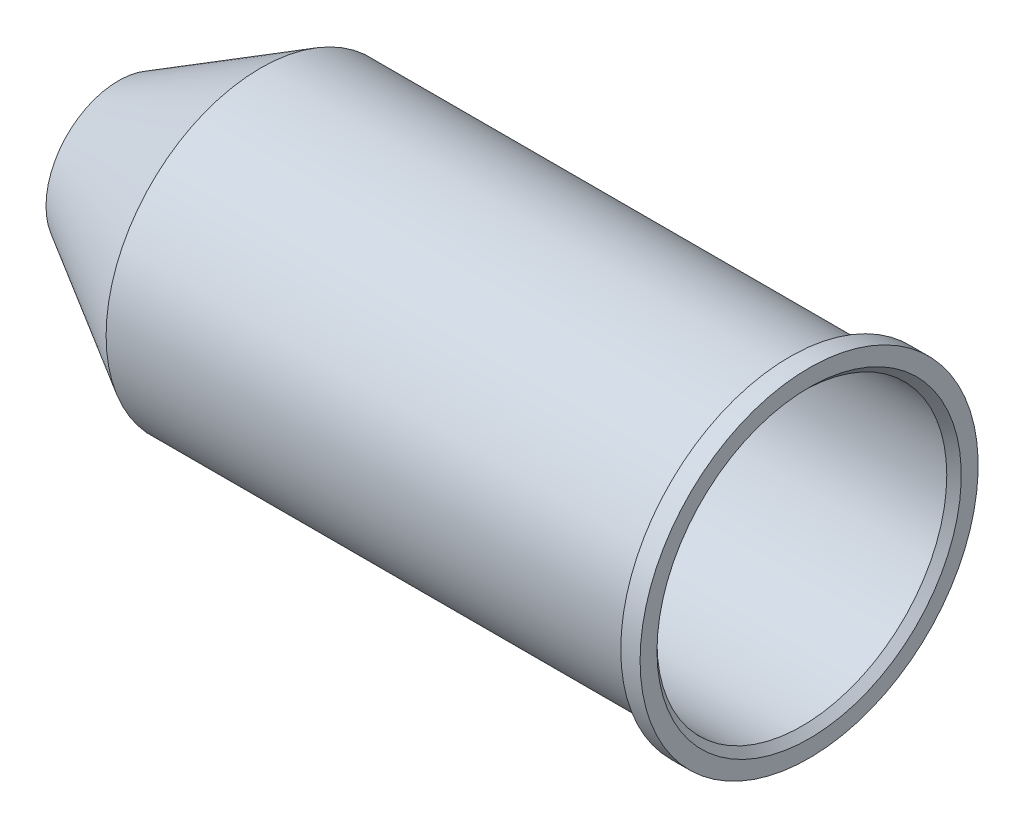
ISO-10303-21;
HEADER;
FILE_DESCRIPTION(('STEP AP214'),'2;1');
FILE_NAME('part.step','',(''),(''),'','','');
FILE_SCHEMA(('AUTOMOTIVE_DESIGN { 1 0 10303 214 1 1 1 1 }'));
ENDSEC;
DATA;
#1=APPLICATION_CONTEXT('core data for automotive mechanical design processes');
#2=APPLICATION_PROTOCOL_DEFINITION('international standard','automotive_design',2000,#1);
#3=PRODUCT_CONTEXT('',#1,'mechanical');
#4=PRODUCT('Part','Part','',(#3));
#5=PRODUCT_RELATED_PRODUCT_CATEGORY('part','',(#4));
#6=PRODUCT_DEFINITION_FORMATION('','',#4);
#7=PRODUCT_DEFINITION_CONTEXT('part definition',#1,'design');
#8=PRODUCT_DEFINITION('design','',#6,#7);
#9=PRODUCT_DEFINITION_SHAPE('','',#8);
#10=(LENGTH_UNIT() NAMED_UNIT(*) SI_UNIT(.MILLI.,.METRE.));
#11=(NAMED_UNIT(*) PLANE_ANGLE_UNIT() SI_UNIT($,.RADIAN.));
#12=(NAMED_UNIT(*) SI_UNIT($,.STERADIAN.) SOLID_ANGLE_UNIT());
#13=UNCERTAINTY_MEASURE_WITH_UNIT(LENGTH_MEASURE(1.E-05),#10,'distance_accuracy_value','');
#14=(GEOMETRIC_REPRESENTATION_CONTEXT(3) GLOBAL_UNCERTAINTY_ASSIGNED_CONTEXT((#13)) GLOBAL_UNIT_ASSIGNED_CONTEXT((#10,
#11,#12)) REPRESENTATION_CONTEXT('',''));
#15=CARTESIAN_POINT('',(0.,0.,0.));
#16=DIRECTION('',(0.,0.,1.));
#17=DIRECTION('',(1.,0.,0.));
#18=AXIS2_PLACEMENT_3D('',#15,#16,#17);
#19=CARTESIAN_POINT('',(0.,15.,0.));
#20=DIRECTION('',(1.,0.,0.));
#21=DIRECTION('',(0.,0.,-1.));
#22=AXIS2_PLACEMENT_3D('',#19,#20,#21);
#23=PLANE('',#22);
#24=CARTESIAN_POINT('',(0.,0.,0.));
#25=DIRECTION('',(-1.,0.,0.));
#26=DIRECTION('',(0.,0.,1.));
#27=AXIS2_PLACEMENT_3D('',#24,#25,#26);
#28=CIRCLE('',#27,12.);
#29=CARTESIAN_POINT('',(0.,0.,12.));
#30=VERTEX_POINT('',#29);
#31=EDGE_CURVE('E10',#30,#30,#28,.T.);
#32=ORIENTED_EDGE('',*,*,#31,.F.);
#33=EDGE_LOOP('',(#32));
#34=FACE_BOUND('',#33,.T.);
#35=CARTESIAN_POINT('',(0.,0.,0.));
#36=DIRECTION('',(-1.,0.,0.));
#37=DIRECTION('',(0.,0.,1.));
#38=AXIS2_PLACEMENT_3D('',#35,#36,#37);
#39=CIRCLE('',#38,15.);
#40=CARTESIAN_POINT('',(0.,0.,15.));
#41=VERTEX_POINT('',#40);
#42=EDGE_CURVE('E95',#41,#41,#39,.T.);
#43=ORIENTED_EDGE('',*,*,#42,.T.);
#44=EDGE_LOOP('',(#43));
#45=FACE_BOUND('',#44,.T.);
#46=ADVANCED_FACE('F40',(#34,#45),#23,.F.);
#47=CARTESIAN_POINT('',(0.,0.,0.));
#48=DIRECTION('',(-1.,0.,0.));
#49=DIRECTION('',(0.,0.,1.));
#50=AXIS2_PLACEMENT_3D('',#47,#48,#49);
#51=CONICAL_SURFACE('',#50,12.,0.26179938779915);
#52=CARTESIAN_POINT('',(16.7942286340599,0.,0.));
#53=DIRECTION('',(-1.,0.,0.));
#54=DIRECTION('',(0.,0.,1.));
#55=AXIS2_PLACEMENT_3D('',#52,#53,#54);
#56=CIRCLE('',#55,7.5);
#57=CARTESIAN_POINT('',(16.7942286340599,0.,7.5));
#58=VERTEX_POINT('',#57);
#59=EDGE_CURVE('E47',#58,#58,#56,.T.);
#60=ORIENTED_EDGE('',*,*,#59,.F.);
#61=EDGE_LOOP('',(#60));
#62=FACE_BOUND('',#61,.T.);
#63=ORIENTED_EDGE('',*,*,#31,.T.);
#64=EDGE_LOOP('',(#63));
#65=FACE_BOUND('',#64,.T.);
#66=ADVANCED_FACE('F163',(#62,#65),#51,.F.);
#67=CARTESIAN_POINT('',(17.3118667242649,0.,0.));
#68=DIRECTION('',(-1.,0.,0.));
#69=DIRECTION('',(0.,0.,1.));
#70=AXIS2_PLACEMENT_3D('',#67,#68,#69);
#71=TOROIDAL_SURFACE('',#70,9.43185165257814,2.);
#72=CARTESIAN_POINT('',(16.9486038435877,0.,0.));
#73=DIRECTION('',(-1.,0.,0.));
#74=DIRECTION('',(0.,0.,1.));
#75=AXIS2_PLACEMENT_3D('',#72,#73,#74);
#76=CIRCLE('',#75,7.46511830015791);
#77=CARTESIAN_POINT('',(16.9486038435877,0.,7.46511830015791));
#78=VERTEX_POINT('',#77);
#79=EDGE_CURVE('E52',#78,#78,#76,.T.);
#80=ORIENTED_EDGE('',*,*,#79,.F.);
#81=EDGE_LOOP('',(#80));
#82=FACE_BOUND('',#81,.T.);
#83=ORIENTED_EDGE('',*,*,#59,.T.);
#84=EDGE_LOOP('',(#83));
#85=FACE_BOUND('',#84,.T.);
#86=ADVANCED_FACE('F158',(#82,#85),#71,.T.);
#87=CARTESIAN_POINT('',(16.9486038435877,0.,0.));
#88=DIRECTION('',(-1.,0.,0.));
#89=DIRECTION('',(0.,0.,1.));
#90=AXIS2_PLACEMENT_3D('',#87,#88,#89);
#91=CONICAL_SURFACE('',#90,7.46511830015791,0.182645233510995);
#92=CARTESIAN_POINT('',(17.6167521910096,0.,0.));
#93=DIRECTION('',(-1.,0.,0.));
#94=DIRECTION('',(0.,0.,1.));
#95=AXIS2_PLACEMENT_3D('',#92,#93,#94);
#96=CIRCLE('',#95,7.34170884401303);
#97=CARTESIAN_POINT('',(17.6167521910096,0.,7.34170884401303));
#98=VERTEX_POINT('',#97);
#99=EDGE_CURVE('E57',#98,#98,#96,.T.);
#100=ORIENTED_EDGE('',*,*,#99,.F.);
#101=EDGE_LOOP('',(#100));
#102=FACE_BOUND('',#101,.T.);
#103=ORIENTED_EDGE('',*,*,#79,.T.);
#104=EDGE_LOOP('',(#103));
#105=FACE_BOUND('',#104,.T.);
#106=ADVANCED_FACE('F152',(#102,#105),#91,.F.);
#107=CARTESIAN_POINT('',(17.9800150716868,0.,0.));
#108=DIRECTION('',(-1.,0.,0.));
#109=DIRECTION('',(0.,0.,1.));
#110=AXIS2_PLACEMENT_3D('',#107,#108,#109);
#111=TOROIDAL_SURFACE('',#110,9.30844219643325,2.00000000000001);
#112=CARTESIAN_POINT('',(19.3942286340599,0.,0.));
#113=DIRECTION('',(-1.,0.,0.));
#114=DIRECTION('',(0.,0.,1.));
#115=AXIS2_PLACEMENT_3D('',#112,#113,#114);
#116=CIRCLE('',#115,7.89422863406014);
#117=CARTESIAN_POINT('',(19.3942286340599,0.,-7.89422863406014));
#118=VERTEX_POINT('',#117);
#119=EDGE_CURVE('E63',#118,#118,#116,.T.);
#120=ORIENTED_EDGE('',*,*,#119,.F.);
#121=EDGE_LOOP('',(#120));
#122=FACE_BOUND('',#121,.T.);
#123=ORIENTED_EDGE('',*,*,#99,.T.);
#124=EDGE_LOOP('',(#123));
#125=FACE_BOUND('',#124,.T.);
#126=ADVANCED_FACE('F146',(#122,#125),#111,.T.);
#127=CARTESIAN_POINT('',(19.3942286340599,0.,0.));
#128=DIRECTION('',(1.,0.,0.));
#129=DIRECTION('',(0.,0.,-1.));
#130=AXIS2_PLACEMENT_3D('',#127,#128,#129);
#131=CONICAL_SURFACE('',#130,7.89422863406014,0.785398163397443);
#132=CARTESIAN_POINT('',(41.5,0.,0.));
#133=DIRECTION('',(-1.,0.,0.));
#134=DIRECTION('',(0.,0.,1.));
#135=AXIS2_PLACEMENT_3D('',#132,#133,#134);
#136=CIRCLE('',#135,30.);
#137=CARTESIAN_POINT('',(41.5,0.,-30.));
#138=VERTEX_POINT('',#137);
#139=EDGE_CURVE('E67',#138,#138,#136,.T.);
#140=CARTESIAN_POINT('',(41.5,0.,-30.));
#141=CARTESIAN_POINT('',(41.2697315482714,0.,-29.7697315482715));
#142=CARTESIAN_POINT('',(41.0394630965429,0.,-29.5394630965429));
#143=CARTESIAN_POINT('',(40.5789261930858,0.,-29.0789261930858));
#144=CARTESIAN_POINT('',(40.3486577413573,0.,-28.8486577413573));
#145=CARTESIAN_POINT('',(39.8881208379002,0.,-28.3881208379002));
#146=CARTESIAN_POINT('',(39.6578523861716,0.,-28.1578523861717));
#147=CARTESIAN_POINT('',(39.1973154827146,0.,-27.6973154827146));
#148=CARTESIAN_POINT('',(38.967047030986,0.,-27.4670470309861));
#149=CARTESIAN_POINT('',(38.5065101275289,0.,-27.006510127529));
#150=CARTESIAN_POINT('',(38.2762416758004,0.,-26.7762416758004));
#151=CARTESIAN_POINT('',(37.8157047723433,0.,-26.3157047723434));
#152=CARTESIAN_POINT('',(37.5854363206148,0.,-26.0854363206148));
#153=CARTESIAN_POINT('',(37.1248994171577,0.,-25.6248994171577));
#154=CARTESIAN_POINT('',(36.8946309654291,0.,-25.3946309654292));
#155=CARTESIAN_POINT('',(36.4340940619721,0.,-24.9340940619721));
#156=CARTESIAN_POINT('',(36.2038256102435,0.,-24.7038256102436));
#157=CARTESIAN_POINT('',(35.7432887067864,0.,-24.2432887067865));
#158=CARTESIAN_POINT('',(35.5130202550579,0.,-24.0130202550579));
#159=CARTESIAN_POINT('',(35.0524833516008,0.,-23.5524833516009));
#160=CARTESIAN_POINT('',(34.8222148998723,0.,-23.3222148998723));
#161=CARTESIAN_POINT('',(34.3616779964152,0.,-22.8616779964152));
#162=CARTESIAN_POINT('',(34.1314095446866,0.,-22.6314095446867));
#163=CARTESIAN_POINT('',(33.6708726412295,0.,-22.1708726412296));
#164=CARTESIAN_POINT('',(33.440604189501,0.,-21.9406041895011));
#165=CARTESIAN_POINT('',(32.9800672860439,0.,-21.480067286044));
#166=CARTESIAN_POINT('',(32.7497988343154,0.,-21.2497988343155));
#167=CARTESIAN_POINT('',(32.2892619308583,0.,-20.7892619308584));
#168=CARTESIAN_POINT('',(32.0589934791297,0.,-20.5589934791298));
#169=CARTESIAN_POINT('',(31.5984565756727,0.,-20.0984565756728));
#170=CARTESIAN_POINT('',(31.3681881239441,0.,-19.8681881239442));
#171=CARTESIAN_POINT('',(30.907651220487,0.,-19.4076512204871));
#172=CARTESIAN_POINT('',(30.6773827687585,0.,-19.1773827687586));
#173=CARTESIAN_POINT('',(30.2168458653014,0.,-18.7168458653015));
#174=CARTESIAN_POINT('',(29.9865774135729,0.,-18.486577413573));
#175=CARTESIAN_POINT('',(29.5260405101158,0.,-18.0260405101159));
#176=CARTESIAN_POINT('',(29.2957720583872,0.,-17.7957720583874));
#177=CARTESIAN_POINT('',(28.8352351549302,0.,-17.3352351549303));
#178=CARTESIAN_POINT('',(28.6049667032016,0.,-17.1049667032017));
#179=CARTESIAN_POINT('',(28.1444297997445,0.,-16.6444297997447));
#180=CARTESIAN_POINT('',(27.914161348016,0.,-16.4141613480161));
#181=CARTESIAN_POINT('',(27.4536244445589,0.,-15.953624444559));
#182=CARTESIAN_POINT('',(27.2233559928304,0.,-15.7233559928305));
#183=CARTESIAN_POINT('',(26.7628190893733,0.,-15.2628190893734));
#184=CARTESIAN_POINT('',(26.5325506376447,0.,-15.0325506376449));
#185=CARTESIAN_POINT('',(26.0720137341876,0.,-14.5720137341878));
#186=CARTESIAN_POINT('',(25.8417452824591,0.,-14.3417452824593));
#187=CARTESIAN_POINT('',(25.381208379002,0.,-13.8812083790022));
#188=CARTESIAN_POINT('',(25.1509399272735,0.,-13.6509399272736));
#189=CARTESIAN_POINT('',(24.6904030238164,0.,-13.1904030238166));
#190=CARTESIAN_POINT('',(24.4601345720878,0.,-12.960134572088));
#191=CARTESIAN_POINT('',(23.9995976686308,0.,-12.4995976686309));
#192=CARTESIAN_POINT('',(23.7693292169022,0.,-12.2693292169024));
#193=CARTESIAN_POINT('',(23.3087923134451,0.,-11.8087923134453));
#194=CARTESIAN_POINT('',(23.0785238617166,0.,-11.5785238617168));
#195=CARTESIAN_POINT('',(22.6179869582595,0.,-11.1179869582597));
#196=CARTESIAN_POINT('',(22.387718506531,0.,-10.8877185065312));
#197=CARTESIAN_POINT('',(21.9271816030739,0.,-10.4271816030741));
#198=CARTESIAN_POINT('',(21.6969131513453,0.,-10.1969131513455));
#199=CARTESIAN_POINT('',(21.2363762478882,0.,-9.73637624788846));
#200=CARTESIAN_POINT('',(21.0061077961597,0.,-9.50610779615992));
#201=CARTESIAN_POINT('',(20.5455708927026,0.,-9.04557089270284));
#202=CARTESIAN_POINT('',(20.3153024409741,0.,-8.8153024409743));
#203=CARTESIAN_POINT('',(19.854765537517,0.,-8.35476553751722));
#204=CARTESIAN_POINT('',(19.6244970857885,0.,-8.12449708578868));
#205=CARTESIAN_POINT('',(19.3942286340599,0.,-7.89422863406014));
#206=B_SPLINE_CURVE_WITH_KNOTS('',3,(#140,#141,#142,#143,#144,#145,#146,#147,#148,#149,#150,
#151,#152,#153,#154,#155,#156,#157,#158,#159,#160,#161,#162,#163,#164,#165,#166,#167,#168,#169,
#170,#171,#172,#173,#174,#175,#176,#177,#178,#179,#180,#181,#182,#183,#184,#185,#186,#187,#188,
#189,#190,#191,#192,#193,#194,#195,#196,#197,#198,#199,#200,#201,#202,#203,#204,#205),
.UNSPECIFIED.,.F.,.F.,(4,2,2,2,2,2,2,2,2,2,2,2,2,2,2,2,2,2,2,2,2,2,2,2,2,2,2,2,2,2,2,2,4),(0.,
0.976946302263471,1.95389260452694,2.93083890679042,3.90778520905389,4.88473151131736,
5.86167781358084,6.83862411584431,7.81557041810778,8.79251672037125,9.76946302263472,
10.7464093248982,11.7233556271617,12.7003019294251,13.6772482316886,14.6541945339521,
15.6311408362156,16.608087138479,17.5850334407425,18.561979743006,19.5389260452694,
20.5158723475329,21.4928186497964,22.4697649520599,23.4467112543233,24.4236575565868,
25.4006038588503,26.3775501611138,27.3544964633772,28.3314427656407,29.3083890679042,
30.2853353701676,31.2622816724311),.UNSPECIFIED.);
#207=EDGE_CURVE('BSEAM140',#138,#118,#206,.T.);
#208=ORIENTED_EDGE('',*,*,#139,.F.);
#209=ORIENTED_EDGE('',*,*,#119,.T.);
#210=ORIENTED_EDGE('',*,*,#207,.T.);
#211=ORIENTED_EDGE('',*,*,#207,.F.);
#212=EDGE_LOOP('',(#208,#210,#209,#211));
#213=FACE_BOUND('',#212,.T.);
#214=ADVANCED_FACE('F140',(#213),#131,.F.);
#215=CARTESIAN_POINT('',(0.,0.,0.));
#216=DIRECTION('',(-1.,0.,0.));
#217=DIRECTION('',(0.,0.,1.));
#218=AXIS2_PLACEMENT_3D('',#215,#216,#217);
#219=CYLINDRICAL_SURFACE('',#218,30.);
#220=CARTESIAN_POINT('',(141.5,0.,0.));
#221=DIRECTION('',(-1.,0.,0.));
#222=DIRECTION('',(0.,0.,1.));
#223=AXIS2_PLACEMENT_3D('',#220,#221,#222);
#224=CIRCLE('',#223,30.);
#225=CARTESIAN_POINT('',(141.5,0.,30.));
#226=VERTEX_POINT('',#225);
#227=EDGE_CURVE('E71',#226,#226,#224,.T.);
#228=ORIENTED_EDGE('',*,*,#227,.F.);
#229=EDGE_LOOP('',(#228));
#230=FACE_BOUND('',#229,.T.);
#231=ORIENTED_EDGE('',*,*,#139,.T.);
#232=EDGE_LOOP('',(#231));
#233=FACE_BOUND('',#232,.T.);
#234=ADVANCED_FACE('F134',(#230,#233),#219,.F.);
#235=CARTESIAN_POINT('',(141.5,0.,0.));
#236=DIRECTION('',(1.,0.,0.));
#237=DIRECTION('',(0.,0.,-1.));
#238=AXIS2_PLACEMENT_3D('',#235,#236,#237);
#239=CONICAL_SURFACE('',#238,30.,0.785398163397448);
#240=CARTESIAN_POINT('',(143.,0.,0.));
#241=DIRECTION('',(-1.,0.,0.));
#242=DIRECTION('',(0.,0.,1.));
#243=AXIS2_PLACEMENT_3D('',#240,#241,#242);
#244=CIRCLE('',#243,31.5);
#245=CARTESIAN_POINT('',(143.,0.,31.5));
#246=VERTEX_POINT('',#245);
#247=EDGE_CURVE('E75',#246,#246,#244,.T.);
#248=ORIENTED_EDGE('',*,*,#247,.F.);
#249=EDGE_LOOP('',(#248));
#250=FACE_BOUND('',#249,.T.);
#251=ORIENTED_EDGE('',*,*,#227,.T.);
#252=EDGE_LOOP('',(#251));
#253=FACE_BOUND('',#252,.T.);
#254=ADVANCED_FACE('F128',(#250,#253),#239,.F.);
#255=CARTESIAN_POINT('',(143.,35.,0.));
#256=DIRECTION('',(-1.,0.,0.));
#257=DIRECTION('',(0.,0.,1.));
#258=AXIS2_PLACEMENT_3D('',#255,#256,#257);
#259=PLANE('',#258);
#260=CARTESIAN_POINT('',(143.,0.,0.));
#261=DIRECTION('',(-1.,0.,0.));
#262=DIRECTION('',(0.,0.,1.));
#263=AXIS2_PLACEMENT_3D('',#260,#261,#262);
#264=CIRCLE('',#263,35.);
#265=CARTESIAN_POINT('',(143.,0.,35.));
#266=VERTEX_POINT('',#265);
#267=EDGE_CURVE('E79',#266,#266,#264,.T.);
#268=ORIENTED_EDGE('',*,*,#267,.F.);
#269=EDGE_LOOP('',(#268));
#270=FACE_BOUND('',#269,.T.);
#271=ORIENTED_EDGE('',*,*,#247,.T.);
#272=EDGE_LOOP('',(#271));
#273=FACE_BOUND('',#272,.T.);
#274=ADVANCED_FACE('F122',(#270,#273),#259,.F.);
#275=CARTESIAN_POINT('',(0.,0.,0.));
#276=DIRECTION('',(-1.,0.,0.));
#277=DIRECTION('',(0.,0.,1.));
#278=AXIS2_PLACEMENT_3D('',#275,#276,#277);
#279=CYLINDRICAL_SURFACE('',#278,35.);
#280=CARTESIAN_POINT('',(139.,0.,0.));
#281=DIRECTION('',(-1.,0.,0.));
#282=DIRECTION('',(0.,0.,1.));
#283=AXIS2_PLACEMENT_3D('',#280,#281,#282);
#284=CIRCLE('',#283,35.);
#285=CARTESIAN_POINT('',(139.,0.,35.));
#286=VERTEX_POINT('',#285);
#287=EDGE_CURVE('E83',#286,#286,#284,.T.);
#288=ORIENTED_EDGE('',*,*,#287,.F.);
#289=EDGE_LOOP('',(#288));
#290=FACE_BOUND('',#289,.T.);
#291=ORIENTED_EDGE('',*,*,#267,.T.);
#292=EDGE_LOOP('',(#291));
#293=FACE_BOUND('',#292,.T.);
#294=ADVANCED_FACE('F116',(#290,#293),#279,.T.);
#295=CARTESIAN_POINT('',(139.,32.,0.));
#296=DIRECTION('',(1.,0.,0.));
#297=DIRECTION('',(0.,0.,-1.));
#298=AXIS2_PLACEMENT_3D('',#295,#296,#297);
#299=PLANE('',#298);
#300=CARTESIAN_POINT('',(139.,0.,0.));
#301=DIRECTION('',(-1.,0.,0.));
#302=DIRECTION('',(0.,0.,1.));
#303=AXIS2_PLACEMENT_3D('',#300,#301,#302);
#304=CIRCLE('',#303,32.);
#305=CARTESIAN_POINT('',(139.,0.,32.));
#306=VERTEX_POINT('',#305);
#307=EDGE_CURVE('E87',#306,#306,#304,.T.);
#308=ORIENTED_EDGE('',*,*,#307,.F.);
#309=EDGE_LOOP('',(#308));
#310=FACE_BOUND('',#309,.T.);
#311=ORIENTED_EDGE('',*,*,#287,.T.);
#312=EDGE_LOOP('',(#311));
#313=FACE_BOUND('',#312,.T.);
#314=ADVANCED_FACE('F110',(#310,#313),#299,.F.);
#315=CARTESIAN_POINT('',(0.,0.,0.));
#316=DIRECTION('',(-1.,0.,0.));
#317=DIRECTION('',(0.,0.,1.));
#318=AXIS2_PLACEMENT_3D('',#315,#316,#317);
#319=CYLINDRICAL_SURFACE('',#318,32.);
#320=CARTESIAN_POINT('',(29.4448637286708,0.,0.));
#321=DIRECTION('',(-1.,0.,0.));
#322=DIRECTION('',(0.,0.,1.));
#323=AXIS2_PLACEMENT_3D('',#320,#321,#322);
#324=CIRCLE('',#323,32.);
#325=CARTESIAN_POINT('',(29.4448637286708,0.,32.));
#326=VERTEX_POINT('',#325);
#327=EDGE_CURVE('E91',#326,#326,#324,.T.);
#328=ORIENTED_EDGE('',*,*,#327,.F.);
#329=EDGE_LOOP('',(#328));
#330=FACE_BOUND('',#329,.T.);
#331=ORIENTED_EDGE('',*,*,#307,.T.);
#332=EDGE_LOOP('',(#331));
#333=FACE_BOUND('',#332,.T.);
#334=ADVANCED_FACE('F104',(#330,#333),#319,.T.);
#335=CARTESIAN_POINT('',(29.4448637286708,0.,0.));
#336=DIRECTION('',(1.,0.,0.));
#337=DIRECTION('',(0.,0.,-1.));
#338=AXIS2_PLACEMENT_3D('',#335,#336,#337);
#339=CONICAL_SURFACE('',#338,32.,0.5235987755983);
#340=ORIENTED_EDGE('',*,*,#42,.F.);
#341=EDGE_LOOP('',(#340));
#342=FACE_BOUND('',#341,.T.);
#343=ORIENTED_EDGE('',*,*,#327,.T.);
#344=EDGE_LOOP('',(#343));
#345=FACE_BOUND('',#344,.T.);
#346=ADVANCED_FACE('F101',(#342,#345),#339,.T.);
#347=CLOSED_SHELL('',(#46,#66,#86,#106,#126,#214,#234,#254,#274,#294,#314,#334,#346));
#348=MANIFOLD_SOLID_BREP('B2',#347);
#349=ADVANCED_BREP_SHAPE_REPRESENTATION('',(#18,#348),#14);
#350=SHAPE_DEFINITION_REPRESENTATION(#9,#349);
ENDSEC;
END-ISO-10303-21;
